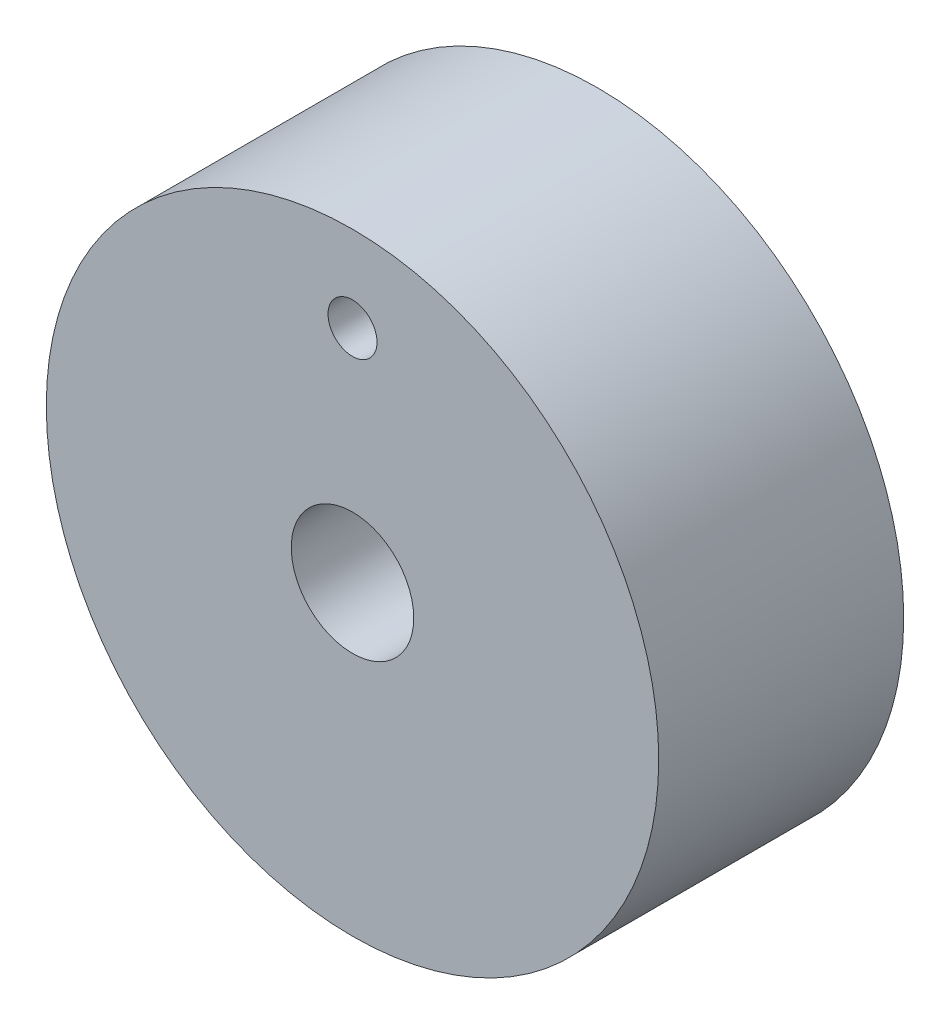
ISO-10303-21;
HEADER;
FILE_DESCRIPTION(('STEP AP214'),'2;1');
FILE_NAME('part.step','',(''),(''),'','','');
FILE_SCHEMA(('AUTOMOTIVE_DESIGN { 1 0 10303 214 1 1 1 1 }'));
ENDSEC;
DATA;
#1=APPLICATION_CONTEXT('core data for automotive mechanical design processes');
#2=APPLICATION_PROTOCOL_DEFINITION('international standard','automotive_design',2000,#1);
#3=PRODUCT_CONTEXT('',#1,'mechanical');
#4=PRODUCT('Part','Part','',(#3));
#5=PRODUCT_RELATED_PRODUCT_CATEGORY('part','',(#4));
#6=PRODUCT_DEFINITION_FORMATION('','',#4);
#7=PRODUCT_DEFINITION_CONTEXT('part definition',#1,'design');
#8=PRODUCT_DEFINITION('design','',#6,#7);
#9=PRODUCT_DEFINITION_SHAPE('','',#8);
#10=(LENGTH_UNIT() NAMED_UNIT(*) SI_UNIT(.MILLI.,.METRE.));
#11=(NAMED_UNIT(*) PLANE_ANGLE_UNIT() SI_UNIT($,.RADIAN.));
#12=(NAMED_UNIT(*) SI_UNIT($,.STERADIAN.) SOLID_ANGLE_UNIT());
#13=UNCERTAINTY_MEASURE_WITH_UNIT(LENGTH_MEASURE(1.E-05),#10,'distance_accuracy_value','');
#14=(GEOMETRIC_REPRESENTATION_CONTEXT(3) GLOBAL_UNCERTAINTY_ASSIGNED_CONTEXT((#13)) GLOBAL_UNIT_ASSIGNED_CONTEXT((#10,
#11,#12)) REPRESENTATION_CONTEXT('',''));
#15=CARTESIAN_POINT('',(0.,0.,0.));
#16=DIRECTION('',(0.,0.,1.));
#17=DIRECTION('',(1.,0.,0.));
#18=AXIS2_PLACEMENT_3D('',#15,#16,#17);
#19=CARTESIAN_POINT('',(0.,0.,10.));
#20=DIRECTION('',(0.,0.,1.));
#21=DIRECTION('',(1.,0.,0.));
#22=AXIS2_PLACEMENT_3D('',#19,#20,#21);
#23=PLANE('',#22);
#24=CARTESIAN_POINT('',(0.,0.,10.));
#25=DIRECTION('',(0.,0.,1.));
#26=DIRECTION('',(1.,0.,0.));
#27=AXIS2_PLACEMENT_3D('',#24,#25,#26);
#28=CIRCLE('',#27,5.);
#29=CARTESIAN_POINT('',(5.,0.,10.));
#30=VERTEX_POINT('',#29);
#31=EDGE_CURVE('E50',#30,#30,#28,.T.);
#32=ORIENTED_EDGE('',*,*,#31,.F.);
#33=EDGE_LOOP('',(#32));
#34=FACE_BOUND('',#33,.T.);
#35=CARTESIAN_POINT('',(0.,0.,10.));
#36=DIRECTION('',(0.,0.,1.));
#37=DIRECTION('',(1.,0.,0.));
#38=AXIS2_PLACEMENT_3D('',#35,#36,#37);
#39=CIRCLE('',#38,25.);
#40=CARTESIAN_POINT('',(25.,0.,10.));
#41=VERTEX_POINT('',#40);
#42=EDGE_CURVE('E10',#41,#41,#39,.T.);
#43=ORIENTED_EDGE('',*,*,#42,.T.);
#44=EDGE_LOOP('',(#43));
#45=FACE_BOUND('',#44,.T.);
#46=CARTESIAN_POINT('',(0.,18.,10.));
#47=DIRECTION('',(0.,0.,1.));
#48=DIRECTION('',(1.,0.,0.));
#49=AXIS2_PLACEMENT_3D('',#46,#47,#48);
#50=CIRCLE('',#49,2.);
#51=CARTESIAN_POINT('',(2.,18.,10.));
#52=VERTEX_POINT('',#51);
#53=EDGE_CURVE('E56',#52,#52,#50,.T.);
#54=ORIENTED_EDGE('',*,*,#53,.F.);
#55=EDGE_LOOP('',(#54));
#56=FACE_BOUND('',#55,.T.);
#57=ADVANCED_FACE('F37',(#34,#45,#56),#23,.T.);
#58=CARTESIAN_POINT('',(0.,0.,-10.));
#59=DIRECTION('',(0.,0.,1.));
#60=DIRECTION('',(1.,0.,0.));
#61=AXIS2_PLACEMENT_3D('',#58,#59,#60);
#62=PLANE('',#61);
#63=CARTESIAN_POINT('',(0.,0.,-10.));
#64=DIRECTION('',(0.,0.,1.));
#65=DIRECTION('',(1.,0.,0.));
#66=AXIS2_PLACEMENT_3D('',#63,#64,#65);
#67=CIRCLE('',#66,25.);
#68=CARTESIAN_POINT('',(25.,0.,-10.));
#69=VERTEX_POINT('',#68);
#70=EDGE_CURVE('E41',#69,#69,#67,.T.);
#71=ORIENTED_EDGE('',*,*,#70,.F.);
#72=EDGE_LOOP('',(#71));
#73=FACE_BOUND('',#72,.T.);
#74=CARTESIAN_POINT('',(0.,0.,-10.));
#75=DIRECTION('',(0.,0.,1.));
#76=DIRECTION('',(1.,0.,0.));
#77=AXIS2_PLACEMENT_3D('',#74,#75,#76);
#78=CIRCLE('',#77,5.);
#79=CARTESIAN_POINT('',(5.,0.,-10.));
#80=VERTEX_POINT('',#79);
#81=EDGE_CURVE('E52',#80,#80,#78,.T.);
#82=ORIENTED_EDGE('',*,*,#81,.T.);
#83=EDGE_LOOP('',(#82));
#84=FACE_BOUND('',#83,.T.);
#85=CARTESIAN_POINT('',(0.,18.,-10.));
#86=DIRECTION('',(0.,0.,1.));
#87=DIRECTION('',(1.,0.,0.));
#88=AXIS2_PLACEMENT_3D('',#85,#86,#87);
#89=CIRCLE('',#88,2.);
#90=CARTESIAN_POINT('',(2.,18.,-10.));
#91=VERTEX_POINT('',#90);
#92=EDGE_CURVE('E60',#91,#91,#89,.T.);
#93=ORIENTED_EDGE('',*,*,#92,.T.);
#94=EDGE_LOOP('',(#93));
#95=FACE_BOUND('',#94,.T.);
#96=ADVANCED_FACE('F72',(#73,#84,#95),#62,.F.);
#97=CARTESIAN_POINT('',(0.,0.,10.));
#98=DIRECTION('',(0.,0.,-1.));
#99=DIRECTION('',(-1.,0.,0.));
#100=AXIS2_PLACEMENT_3D('',#97,#98,#99);
#101=CYLINDRICAL_SURFACE('',#100,25.);
#102=ORIENTED_EDGE('',*,*,#42,.F.);
#103=EDGE_LOOP('',(#102));
#104=FACE_BOUND('',#103,.T.);
#105=ORIENTED_EDGE('',*,*,#70,.T.);
#106=EDGE_LOOP('',(#105));
#107=FACE_BOUND('',#106,.T.);
#108=ADVANCED_FACE('F39',(#104,#107),#101,.T.);
#109=CARTESIAN_POINT('',(0.,0.,10.));
#110=DIRECTION('',(0.,0.,-1.));
#111=DIRECTION('',(-1.,0.,0.));
#112=AXIS2_PLACEMENT_3D('',#109,#110,#111);
#113=CYLINDRICAL_SURFACE('',#112,5.);
#114=ORIENTED_EDGE('',*,*,#31,.T.);
#115=EDGE_LOOP('',(#114));
#116=FACE_BOUND('',#115,.T.);
#117=ORIENTED_EDGE('',*,*,#81,.F.);
#118=EDGE_LOOP('',(#117));
#119=FACE_BOUND('',#118,.T.);
#120=ADVANCED_FACE('F81',(#116,#119),#113,.F.);
#121=CARTESIAN_POINT('',(0.,18.,10.));
#122=DIRECTION('',(0.,0.,-1.));
#123=DIRECTION('',(-1.,0.,0.));
#124=AXIS2_PLACEMENT_3D('',#121,#122,#123);
#125=CYLINDRICAL_SURFACE('',#124,2.);
#126=ORIENTED_EDGE('',*,*,#53,.T.);
#127=EDGE_LOOP('',(#126));
#128=FACE_BOUND('',#127,.T.);
#129=ORIENTED_EDGE('',*,*,#92,.F.);
#130=EDGE_LOOP('',(#129));
#131=FACE_BOUND('',#130,.T.);
#132=ADVANCED_FACE('F68',(#128,#131),#125,.F.);
#133=CLOSED_SHELL('',(#57,#96,#108,#120,#132));
#134=MANIFOLD_SOLID_BREP('B2',#133);
#135=ADVANCED_BREP_SHAPE_REPRESENTATION('',(#18,#134),#14);
#136=SHAPE_DEFINITION_REPRESENTATION(#9,#135);
ENDSEC;
END-ISO-10303-21;
